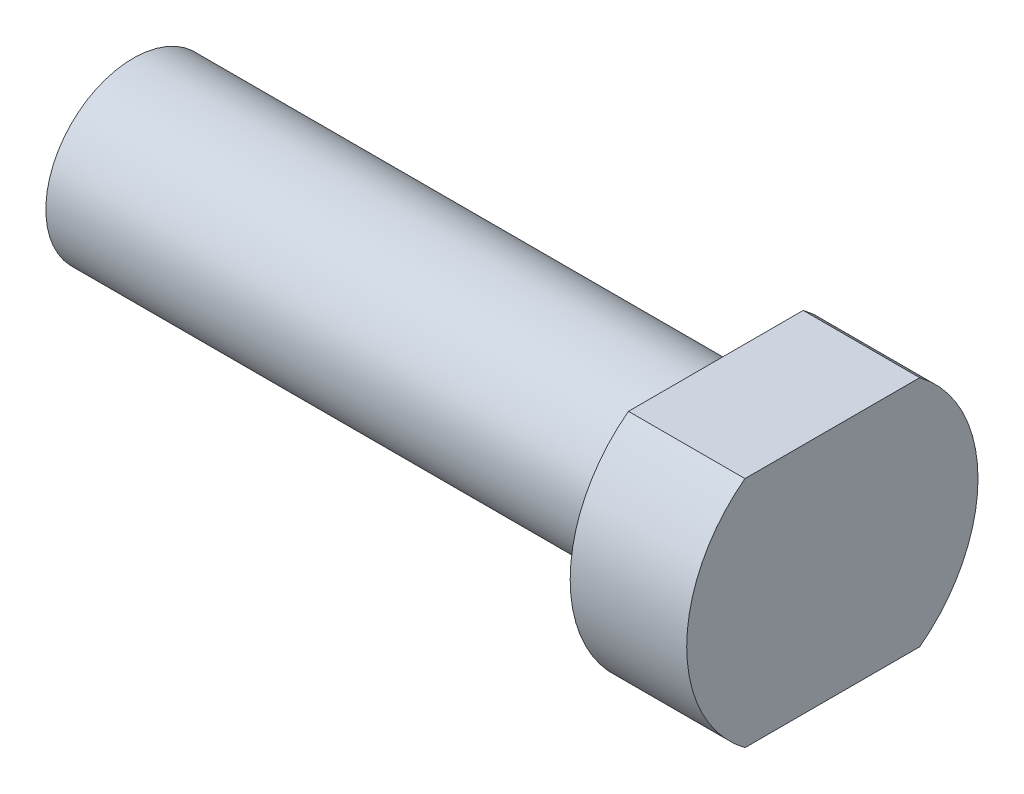
ISO-10303-21;
HEADER;
FILE_DESCRIPTION(('STEP AP214'),'2;1');
FILE_NAME('part.step','',(''),(''),'','','');
FILE_SCHEMA(('AUTOMOTIVE_DESIGN { 1 0 10303 214 1 1 1 1 }'));
ENDSEC;
DATA;
#1=APPLICATION_CONTEXT('core data for automotive mechanical design processes');
#2=APPLICATION_PROTOCOL_DEFINITION('international standard','automotive_design',2000,#1);
#3=PRODUCT_CONTEXT('',#1,'mechanical');
#4=PRODUCT('Part','Part','',(#3));
#5=PRODUCT_RELATED_PRODUCT_CATEGORY('part','',(#4));
#6=PRODUCT_DEFINITION_FORMATION('','',#4);
#7=PRODUCT_DEFINITION_CONTEXT('part definition',#1,'design');
#8=PRODUCT_DEFINITION('design','',#6,#7);
#9=PRODUCT_DEFINITION_SHAPE('','',#8);
#10=(LENGTH_UNIT() NAMED_UNIT(*) SI_UNIT(.MILLI.,.METRE.));
#11=(NAMED_UNIT(*) PLANE_ANGLE_UNIT() SI_UNIT($,.RADIAN.));
#12=(NAMED_UNIT(*) SI_UNIT($,.STERADIAN.) SOLID_ANGLE_UNIT());
#13=UNCERTAINTY_MEASURE_WITH_UNIT(LENGTH_MEASURE(1.E-05),#10,'distance_accuracy_value','');
#14=(GEOMETRIC_REPRESENTATION_CONTEXT(3) GLOBAL_UNCERTAINTY_ASSIGNED_CONTEXT((#13)) GLOBAL_UNIT_ASSIGNED_CONTEXT((#10,
#11,#12)) REPRESENTATION_CONTEXT('',''));
#15=CARTESIAN_POINT('',(0.,0.,0.));
#16=DIRECTION('',(0.,0.,1.));
#17=DIRECTION('',(1.,0.,0.));
#18=AXIS2_PLACEMENT_3D('',#15,#16,#17);
#19=CARTESIAN_POINT('',(12.,0.,0.));
#20=DIRECTION('',(1.,0.,0.));
#21=DIRECTION('',(0.,0.,-1.));
#22=AXIS2_PLACEMENT_3D('',#19,#20,#21);
#23=CYLINDRICAL_SURFACE('',#22,2.5);
#24=CARTESIAN_POINT('',(10.,0.,0.));
#25=DIRECTION('',(1.,0.,0.));
#26=DIRECTION('',(0.,0.,-1.));
#27=AXIS2_PLACEMENT_3D('',#24,#25,#26);
#28=CIRCLE('',#27,2.5);
#29=CARTESIAN_POINT('',(10.,2.,1.5));
#30=VERTEX_POINT('',#29);
#31=CARTESIAN_POINT('',(10.,-2.,1.5));
#32=VERTEX_POINT('',#31);
#33=EDGE_CURVE('E87',#30,#32,#28,.T.);
#34=ORIENTED_EDGE('',*,*,#33,.T.);
#35=DIRECTION('',(1.,0.,0.));
#36=VECTOR('',#35,1.);
#37=CARTESIAN_POINT('',(10.,-2.,1.5));
#38=LINE('',#37,#36);
#39=CARTESIAN_POINT('',(12.,-2.,1.5));
#40=VERTEX_POINT('',#39);
#41=EDGE_CURVE('E72',#32,#40,#38,.T.);
#42=ORIENTED_EDGE('',*,*,#41,.T.);
#43=CARTESIAN_POINT('',(12.,0.,0.));
#44=DIRECTION('',(1.,0.,0.));
#45=DIRECTION('',(0.,0.,-1.));
#46=AXIS2_PLACEMENT_3D('',#43,#44,#45);
#47=CIRCLE('',#46,2.5);
#48=CARTESIAN_POINT('',(12.,2.,1.5));
#49=VERTEX_POINT('',#48);
#50=EDGE_CURVE('E94',#49,#40,#47,.T.);
#51=ORIENTED_EDGE('',*,*,#50,.F.);
#52=DIRECTION('',(1.,0.,0.));
#53=VECTOR('',#52,1.);
#54=CARTESIAN_POINT('',(12.,2.,1.5));
#55=LINE('',#54,#53);
#56=EDGE_CURVE('E55',#30,#49,#55,.T.);
#57=ORIENTED_EDGE('',*,*,#56,.F.);
#58=EDGE_LOOP('',(#34,#42,#51,#57));
#59=FACE_BOUND('',#58,.T.);
#60=ADVANCED_FACE('F33',(#59),#23,.T.);
#61=CARTESIAN_POINT('',(10.,-1.5,0.));
#62=DIRECTION('',(1.,0.,0.));
#63=DIRECTION('',(0.,0.,-1.));
#64=AXIS2_PLACEMENT_3D('',#61,#62,#63);
#65=PLANE('',#64);
#66=CARTESIAN_POINT('',(10.,0.,0.));
#67=DIRECTION('',(1.,0.,0.));
#68=DIRECTION('',(0.,0.,-1.));
#69=AXIS2_PLACEMENT_3D('',#66,#67,#68);
#70=CIRCLE('',#69,1.5);
#71=CARTESIAN_POINT('',(10.,0.,-1.5));
#72=VERTEX_POINT('',#71);
#73=EDGE_CURVE('E90',#72,#72,#70,.T.);
#74=ORIENTED_EDGE('',*,*,#73,.T.);
#75=EDGE_LOOP('',(#74));
#76=FACE_BOUND('',#75,.T.);
#77=CARTESIAN_POINT('',(10.,-2.,-1.5));
#78=VERTEX_POINT('',#77);
#79=CARTESIAN_POINT('',(10.,2.,-1.5));
#80=VERTEX_POINT('',#79);
#81=EDGE_CURVE('E88',#78,#80,#28,.T.);
#82=ORIENTED_EDGE('',*,*,#81,.F.);
#83=DIRECTION('',(0.,0.,1.));
#84=VECTOR('',#83,1.);
#85=CARTESIAN_POINT('',(10.,-2.,-1.5));
#86=LINE('',#85,#84);
#87=EDGE_CURVE('E75',#78,#32,#86,.T.);
#88=ORIENTED_EDGE('',*,*,#87,.T.);
#89=ORIENTED_EDGE('',*,*,#33,.F.);
#90=DIRECTION('',(0.,0.,1.));
#91=VECTOR('',#90,1.);
#92=CARTESIAN_POINT('',(10.,2.,-2.5));
#93=LINE('',#92,#91);
#94=EDGE_CURVE('E131',#80,#30,#93,.T.);
#95=ORIENTED_EDGE('',*,*,#94,.F.);
#96=EDGE_LOOP('',(#82,#88,#89,#95));
#97=FACE_BOUND('',#96,.T.);
#98=ADVANCED_FACE('F85',(#76,#97),#65,.F.);
#99=CARTESIAN_POINT('',(12.,-2.,-1.5));
#100=VERTEX_POINT('',#99);
#101=CARTESIAN_POINT('',(12.,2.,-1.5));
#102=VERTEX_POINT('',#101);
#103=EDGE_CURVE('E128',#100,#102,#47,.T.);
#104=ORIENTED_EDGE('',*,*,#103,.F.);
#105=DIRECTION('',(-1.,0.,0.));
#106=VECTOR('',#105,1.);
#107=CARTESIAN_POINT('',(10.,-2.,-1.5));
#108=LINE('',#107,#106);
#109=EDGE_CURVE('E48',#100,#78,#108,.T.);
#110=ORIENTED_EDGE('',*,*,#109,.T.);
#111=ORIENTED_EDGE('',*,*,#81,.T.);
#112=DIRECTION('',(1.,0.,0.));
#113=VECTOR('',#112,1.);
#114=CARTESIAN_POINT('',(12.,2.,-1.5));
#115=LINE('',#114,#113);
#116=EDGE_CURVE('E130',#102,#80,#115,.F.);
#117=ORIENTED_EDGE('',*,*,#116,.F.);
#118=EDGE_LOOP('',(#104,#110,#111,#117));
#119=FACE_BOUND('',#118,.T.);
#120=ADVANCED_FACE('F111',(#119),#23,.T.);
#121=CARTESIAN_POINT('',(12.,-2.5,0.));
#122=DIRECTION('',(-1.,0.,0.));
#123=DIRECTION('',(0.,0.,1.));
#124=AXIS2_PLACEMENT_3D('',#121,#122,#123);
#125=PLANE('',#124);
#126=ORIENTED_EDGE('',*,*,#50,.T.);
#127=DIRECTION('',(0.,0.,-1.));
#128=VECTOR('',#127,1.);
#129=CARTESIAN_POINT('',(12.,-2.,-1.5));
#130=LINE('',#129,#128);
#131=EDGE_CURVE('E76',#40,#100,#130,.T.);
#132=ORIENTED_EDGE('',*,*,#131,.T.);
#133=ORIENTED_EDGE('',*,*,#103,.T.);
#134=DIRECTION('',(0.,0.,-1.));
#135=VECTOR('',#134,1.);
#136=CARTESIAN_POINT('',(12.,2.,0.));
#137=LINE('',#136,#135);
#138=EDGE_CURVE('E11',#49,#102,#137,.T.);
#139=ORIENTED_EDGE('',*,*,#138,.F.);
#140=EDGE_LOOP('',(#126,#132,#133,#139));
#141=FACE_BOUND('',#140,.T.);
#142=ADVANCED_FACE('F103',(#141),#125,.F.);
#143=CARTESIAN_POINT('',(0.,0.,0.));
#144=DIRECTION('',(1.,0.,0.));
#145=DIRECTION('',(0.,0.,-1.));
#146=AXIS2_PLACEMENT_3D('',#143,#144,#145);
#147=PLANE('',#146);
#148=CARTESIAN_POINT('',(0.,0.,0.));
#149=DIRECTION('',(1.,0.,0.));
#150=DIRECTION('',(0.,0.,-1.));
#151=AXIS2_PLACEMENT_3D('',#148,#149,#150);
#152=CIRCLE('',#151,1.5);
#153=CARTESIAN_POINT('',(0.,0.,-1.5));
#154=VERTEX_POINT('',#153);
#155=EDGE_CURVE('E41',#154,#154,#152,.T.);
#156=ORIENTED_EDGE('',*,*,#155,.F.);
#157=EDGE_LOOP('',(#156));
#158=FACE_BOUND('',#157,.T.);
#159=ADVANCED_FACE('F35',(#158),#147,.F.);
#160=CARTESIAN_POINT('',(12.,0.,0.));
#161=DIRECTION('',(1.,0.,0.));
#162=DIRECTION('',(0.,0.,-1.));
#163=AXIS2_PLACEMENT_3D('',#160,#161,#162);
#164=CYLINDRICAL_SURFACE('',#163,1.5);
#165=ORIENTED_EDGE('',*,*,#73,.F.);
#166=EDGE_LOOP('',(#165));
#167=FACE_BOUND('',#166,.T.);
#168=ORIENTED_EDGE('',*,*,#155,.T.);
#169=EDGE_LOOP('',(#168));
#170=FACE_BOUND('',#169,.T.);
#171=ADVANCED_FACE('F100',(#167,#170),#164,.T.);
#172=CARTESIAN_POINT('',(0.,2.,0.));
#173=DIRECTION('',(0.,1.,0.));
#174=DIRECTION('',(0.,0.,1.));
#175=AXIS2_PLACEMENT_3D('',#172,#173,#174);
#176=PLANE('',#175);
#177=ORIENTED_EDGE('',*,*,#56,.T.);
#178=ORIENTED_EDGE('',*,*,#138,.T.);
#179=ORIENTED_EDGE('',*,*,#116,.T.);
#180=ORIENTED_EDGE('',*,*,#94,.T.);
#181=EDGE_LOOP('',(#177,#178,#179,#180));
#182=FACE_BOUND('',#181,.T.);
#183=ADVANCED_FACE('F108',(#182),#176,.T.);
#184=CARTESIAN_POINT('',(0.,-2.,0.));
#185=DIRECTION('',(0.,1.,0.));
#186=DIRECTION('',(0.,0.,1.));
#187=AXIS2_PLACEMENT_3D('',#184,#185,#186);
#188=PLANE('',#187);
#189=ORIENTED_EDGE('',*,*,#87,.F.);
#190=ORIENTED_EDGE('',*,*,#109,.F.);
#191=ORIENTED_EDGE('',*,*,#131,.F.);
#192=ORIENTED_EDGE('',*,*,#41,.F.);
#193=EDGE_LOOP('',(#189,#190,#191,#192));
#194=FACE_BOUND('',#193,.T.);
#195=ADVANCED_FACE('F74',(#194),#188,.F.);
#196=CLOSED_SHELL('',(#60,#98,#120,#142,#159,#171,#183,#195));
#197=MANIFOLD_SOLID_BREP('B2',#196);
#198=ADVANCED_BREP_SHAPE_REPRESENTATION('',(#18,#197),#14);
#199=SHAPE_DEFINITION_REPRESENTATION(#9,#198);
ENDSEC;
END-ISO-10303-21;
